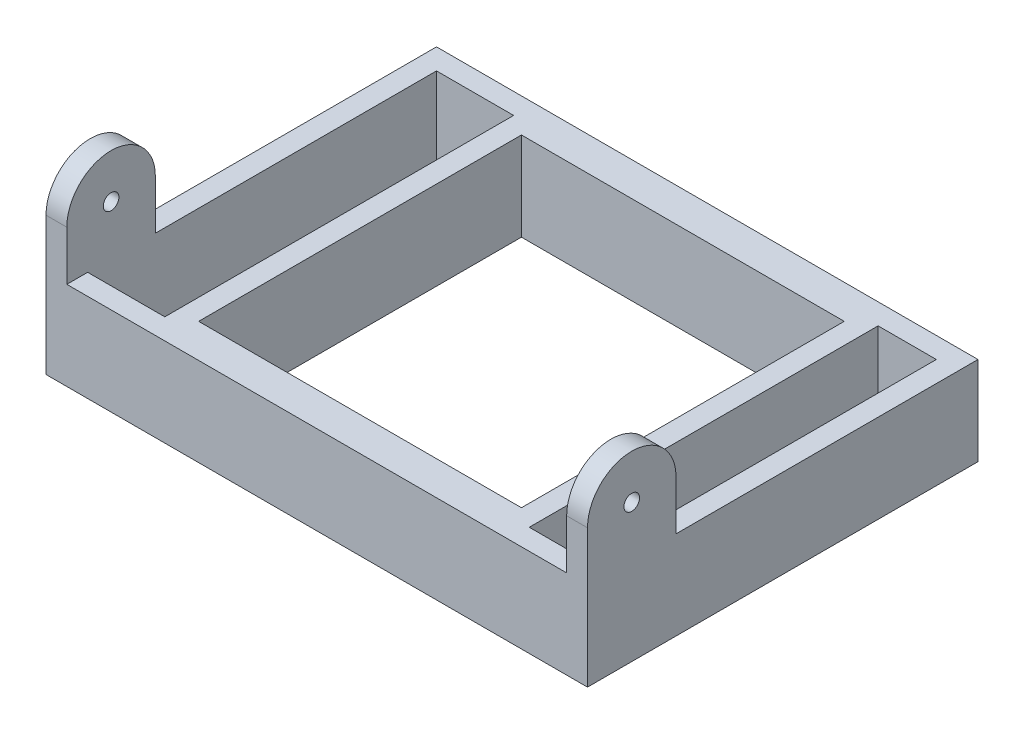
ISO-10303-21;
HEADER;
FILE_DESCRIPTION(('STEP AP214'),'2;1');
FILE_NAME('part.step','',(''),(''),'','','');
FILE_SCHEMA(('AUTOMOTIVE_DESIGN { 1 0 10303 214 1 1 1 1 }'));
ENDSEC;
DATA;
#1=APPLICATION_CONTEXT('core data for automotive mechanical design processes');
#2=APPLICATION_PROTOCOL_DEFINITION('international standard','automotive_design',2000,#1);
#3=PRODUCT_CONTEXT('',#1,'mechanical');
#4=PRODUCT('Part','Part','',(#3));
#5=PRODUCT_RELATED_PRODUCT_CATEGORY('part','',(#4));
#6=PRODUCT_DEFINITION_FORMATION('','',#4);
#7=PRODUCT_DEFINITION_CONTEXT('part definition',#1,'design');
#8=PRODUCT_DEFINITION('design','',#6,#7);
#9=PRODUCT_DEFINITION_SHAPE('','',#8);
#10=(LENGTH_UNIT() NAMED_UNIT(*) SI_UNIT(.MILLI.,.METRE.));
#11=(NAMED_UNIT(*) PLANE_ANGLE_UNIT() SI_UNIT($,.RADIAN.));
#12=(NAMED_UNIT(*) SI_UNIT($,.STERADIAN.) SOLID_ANGLE_UNIT());
#13=UNCERTAINTY_MEASURE_WITH_UNIT(LENGTH_MEASURE(1.E-05),#10,'distance_accuracy_value','');
#14=(GEOMETRIC_REPRESENTATION_CONTEXT(3) GLOBAL_UNCERTAINTY_ASSIGNED_CONTEXT((#13)) GLOBAL_UNIT_ASSIGNED_CONTEXT((#10,
#11,#12)) REPRESENTATION_CONTEXT('',''));
#15=CARTESIAN_POINT('',(0.,0.,0.));
#16=DIRECTION('',(0.,0.,1.));
#17=DIRECTION('',(1.,0.,0.));
#18=AXIS2_PLACEMENT_3D('',#15,#16,#17);
#19=CARTESIAN_POINT('',(-24.9824031216202,17.,-67.0993378787123));
#20=DIRECTION('',(1.,0.,0.));
#21=DIRECTION('',(0.,0.,-1.));
#22=AXIS2_PLACEMENT_3D('',#19,#20,#21);
#23=PLANE('',#22);
#24=DIRECTION('',(0.,-1.,0.));
#25=VECTOR('',#24,1.);
#26=CARTESIAN_POINT('',(-24.9824031216202,17.,7.90066212128765));
#27=LINE('',#26,#25);
#28=CARTESIAN_POINT('',(-24.9824031216202,26.5,7.90066212128765));
#29=VERTEX_POINT('',#28);
#30=CARTESIAN_POINT('',(-24.9824031216202,0.,7.90066212128765));
#31=VERTEX_POINT('',#30);
#32=EDGE_CURVE('E73',#29,#31,#27,.T.);
#33=ORIENTED_EDGE('',*,*,#32,.F.);
#34=CARTESIAN_POINT('',(-24.9824031216202,26.5,-0.599337878712353));
#35=DIRECTION('',(-1.,0.,0.));
#36=DIRECTION('',(0.,0.,1.));
#37=AXIS2_PLACEMENT_3D('',#34,#35,#36);
#38=CIRCLE('',#37,8.5);
#39=CARTESIAN_POINT('',(-24.9824031216202,26.5,-9.09933787871235));
#40=VERTEX_POINT('',#39);
#41=EDGE_CURVE('E216',#40,#29,#38,.F.);
#42=ORIENTED_EDGE('',*,*,#41,.F.);
#43=DIRECTION('',(0.,-1.,0.));
#44=VECTOR('',#43,1.);
#45=CARTESIAN_POINT('',(-24.9824031216202,35.,-9.09933787871235));
#46=LINE('',#45,#44);
#47=CARTESIAN_POINT('',(-24.9824031216202,17.,-9.09933787871235));
#48=VERTEX_POINT('',#47);
#49=EDGE_CURVE('E412',#40,#48,#46,.T.);
#50=ORIENTED_EDGE('',*,*,#49,.T.);
#51=DIRECTION('',(0.,0.,1.));
#52=VECTOR('',#51,1.);
#53=CARTESIAN_POINT('',(-24.9824031216202,17.,-67.0993378787123));
#54=LINE('',#53,#52);
#55=CARTESIAN_POINT('',(-24.9824031216202,17.,-67.0993378787123));
#56=VERTEX_POINT('',#55);
#57=EDGE_CURVE('E273',#56,#48,#54,.T.);
#58=ORIENTED_EDGE('',*,*,#57,.F.);
#59=DIRECTION('',(0.,-1.,0.));
#60=VECTOR('',#59,1.);
#61=CARTESIAN_POINT('',(-24.9824031216202,17.,-67.0993378787123));
#62=LINE('',#61,#60);
#63=CARTESIAN_POINT('',(-24.9824031216202,0.,-67.0993378787123));
#64=VERTEX_POINT('',#63);
#65=EDGE_CURVE('E12',#56,#64,#62,.T.);
#66=ORIENTED_EDGE('',*,*,#65,.T.);
#67=DIRECTION('',(0.,0.,1.));
#68=VECTOR('',#67,1.);
#69=CARTESIAN_POINT('',(-24.9824031216202,0.,-67.0993378787123));
#70=LINE('',#69,#68);
#71=EDGE_CURVE('E240',#64,#31,#70,.T.);
#72=ORIENTED_EDGE('',*,*,#71,.T.);
#73=EDGE_LOOP('',(#33,#42,#50,#58,#66,#72));
#74=FACE_BOUND('',#73,.T.);
#75=CARTESIAN_POINT('',(-24.9824031216202,26.5,-0.599337878712353));
#76=DIRECTION('',(-1.,0.,0.));
#77=DIRECTION('',(0.,0.,1.));
#78=AXIS2_PLACEMENT_3D('',#75,#76,#77);
#79=CIRCLE('',#78,1.5);
#80=CARTESIAN_POINT('',(-24.9824031216202,26.5,0.900662121287647));
#81=VERTEX_POINT('',#80);
#82=EDGE_CURVE('E237',#81,#81,#79,.T.);
#83=ORIENTED_EDGE('',*,*,#82,.F.);
#84=EDGE_LOOP('',(#83));
#85=FACE_BOUND('',#84,.T.);
#86=ADVANCED_FACE('F63',(#74,#85),#23,.F.);
#87=CARTESIAN_POINT('',(79.0175968783798,17.,7.90066212128765));
#88=DIRECTION('',(-1.,0.,0.));
#89=DIRECTION('',(0.,0.,1.));
#90=AXIS2_PLACEMENT_3D('',#87,#88,#89);
#91=PLANE('',#90);
#92=CARTESIAN_POINT('',(79.0175968783798,26.5,-0.599337878712353));
#93=DIRECTION('',(-1.,0.,0.));
#94=DIRECTION('',(0.,0.,1.));
#95=AXIS2_PLACEMENT_3D('',#92,#93,#94);
#96=CIRCLE('',#95,8.5);
#97=CARTESIAN_POINT('',(79.0175968783798,26.5,-9.09933787871235));
#98=VERTEX_POINT('',#97);
#99=CARTESIAN_POINT('',(79.0175968783798,26.5,7.90066212128765));
#100=VERTEX_POINT('',#99);
#101=EDGE_CURVE('E437',#98,#100,#96,.F.);
#102=ORIENTED_EDGE('',*,*,#101,.T.);
#103=DIRECTION('',(0.,-1.,0.));
#104=VECTOR('',#103,1.);
#105=CARTESIAN_POINT('',(79.0175968783798,17.,7.90066212128765));
#106=LINE('',#105,#104);
#107=CARTESIAN_POINT('',(79.0175968783798,0.,7.90066212128765));
#108=VERTEX_POINT('',#107);
#109=EDGE_CURVE('E243',#100,#108,#106,.T.);
#110=ORIENTED_EDGE('',*,*,#109,.T.);
#111=DIRECTION('',(0.,0.,-1.));
#112=VECTOR('',#111,1.);
#113=CARTESIAN_POINT('',(79.0175968783798,0.,7.90066212128765));
#114=LINE('',#113,#112);
#115=CARTESIAN_POINT('',(79.0175968783798,0.,-67.0993378787123));
#116=VERTEX_POINT('',#115);
#117=EDGE_CURVE('E253',#108,#116,#114,.T.);
#118=ORIENTED_EDGE('',*,*,#117,.T.);
#119=DIRECTION('',(0.,-1.,0.));
#120=VECTOR('',#119,1.);
#121=CARTESIAN_POINT('',(79.0175968783798,17.,-67.0993378787123));
#122=LINE('',#121,#120);
#123=CARTESIAN_POINT('',(79.0175968783798,17.,-67.0993378787123));
#124=VERTEX_POINT('',#123);
#125=EDGE_CURVE('E246',#124,#116,#122,.T.);
#126=ORIENTED_EDGE('',*,*,#125,.F.);
#127=DIRECTION('',(0.,0.,-1.));
#128=VECTOR('',#127,1.);
#129=CARTESIAN_POINT('',(79.0175968783798,17.,7.90066212128765));
#130=LINE('',#129,#128);
#131=CARTESIAN_POINT('',(79.0175968783798,17.,-9.09933787871235));
#132=VERTEX_POINT('',#131);
#133=EDGE_CURVE('E252',#132,#124,#130,.T.);
#134=ORIENTED_EDGE('',*,*,#133,.F.);
#135=DIRECTION('',(0.,-1.,0.));
#136=VECTOR('',#135,1.);
#137=CARTESIAN_POINT('',(79.0175968783798,35.,-9.09933787871235));
#138=LINE('',#137,#136);
#139=EDGE_CURVE('E422',#98,#132,#138,.T.);
#140=ORIENTED_EDGE('',*,*,#139,.F.);
#141=EDGE_LOOP('',(#102,#110,#118,#126,#134,#140));
#142=FACE_BOUND('',#141,.T.);
#143=CARTESIAN_POINT('',(79.0175968783798,26.5,-0.599337878712353));
#144=DIRECTION('',(-1.,0.,0.));
#145=DIRECTION('',(0.,0.,1.));
#146=AXIS2_PLACEMENT_3D('',#143,#144,#145);
#147=CIRCLE('',#146,1.5);
#148=CARTESIAN_POINT('',(79.0175968783798,26.5,0.900662121287647));
#149=VERTEX_POINT('',#148);
#150=EDGE_CURVE('E227',#149,#149,#147,.T.);
#151=ORIENTED_EDGE('',*,*,#150,.T.);
#152=EDGE_LOOP('',(#151));
#153=FACE_BOUND('',#152,.T.);
#154=ADVANCED_FACE('F462',(#142,#153),#91,.F.);
#155=CARTESIAN_POINT('',(-20.9824031216202,17.,-63.0993378787123));
#156=DIRECTION('',(1.,0.,0.));
#157=DIRECTION('',(0.,0.,-1.));
#158=AXIS2_PLACEMENT_3D('',#155,#156,#157);
#159=PLANE('',#158);
#160=CARTESIAN_POINT('',(-20.9824031216202,26.5,-0.599337878712353));
#161=DIRECTION('',(1.,0.,0.));
#162=DIRECTION('',(0.,0.,-1.));
#163=AXIS2_PLACEMENT_3D('',#160,#161,#162);
#164=CIRCLE('',#163,8.5);
#165=CARTESIAN_POINT('',(-20.9824031216202,26.5,7.90066212128765));
#166=VERTEX_POINT('',#165);
#167=CARTESIAN_POINT('',(-20.9824031216202,26.5,-9.09933787871235));
#168=VERTEX_POINT('',#167);
#169=EDGE_CURVE('E440',#166,#168,#164,.F.);
#170=ORIENTED_EDGE('',*,*,#169,.F.);
#171=DIRECTION('',(0.,-1.,0.));
#172=VECTOR('',#171,1.);
#173=CARTESIAN_POINT('',(-20.9824031216202,35.,7.90066212128765));
#174=LINE('',#173,#172);
#175=CARTESIAN_POINT('',(-20.9824031216202,17.,7.90066212128765));
#176=VERTEX_POINT('',#175);
#177=EDGE_CURVE('E234',#166,#176,#174,.T.);
#178=ORIENTED_EDGE('',*,*,#177,.T.);
#179=DIRECTION('',(0.,0.,-1.));
#180=VECTOR('',#179,1.);
#181=CARTESIAN_POINT('',(-20.9824031216202,17.,7.90066212128765));
#182=LINE('',#181,#180);
#183=CARTESIAN_POINT('',(-20.9824031216202,17.,3.90066212128765));
#184=VERTEX_POINT('',#183);
#185=EDGE_CURVE('E419',#176,#184,#182,.T.);
#186=ORIENTED_EDGE('',*,*,#185,.T.);
#187=DIRECTION('',(0.,-1.,0.));
#188=VECTOR('',#187,1.);
#189=CARTESIAN_POINT('',(-20.9824031216202,17.,3.90066212128765));
#190=LINE('',#189,#188);
#191=CARTESIAN_POINT('',(-20.9824031216202,0.,3.90066212128765));
#192=VERTEX_POINT('',#191);
#193=EDGE_CURVE('E311',#184,#192,#190,.T.);
#194=ORIENTED_EDGE('',*,*,#193,.T.);
#195=DIRECTION('',(0.,0.,1.));
#196=VECTOR('',#195,1.);
#197=CARTESIAN_POINT('',(-20.9824031216202,0.,-63.0993378787123));
#198=LINE('',#197,#196);
#199=CARTESIAN_POINT('',(-20.9824031216202,0.,-63.0993378787123));
#200=VERTEX_POINT('',#199);
#201=EDGE_CURVE('E350',#200,#192,#198,.T.);
#202=ORIENTED_EDGE('',*,*,#201,.F.);
#203=DIRECTION('',(0.,-1.,0.));
#204=VECTOR('',#203,1.);
#205=CARTESIAN_POINT('',(-20.9824031216202,17.,-63.0993378787123));
#206=LINE('',#205,#204);
#207=CARTESIAN_POINT('',(-20.9824031216202,17.,-63.0993378787123));
#208=VERTEX_POINT('',#207);
#209=EDGE_CURVE('E332',#208,#200,#206,.T.);
#210=ORIENTED_EDGE('',*,*,#209,.F.);
#211=DIRECTION('',(0.,0.,1.));
#212=VECTOR('',#211,1.);
#213=CARTESIAN_POINT('',(-20.9824031216202,17.,-63.0993378787123));
#214=LINE('',#213,#212);
#215=CARTESIAN_POINT('',(-20.9824031216202,17.,-9.09933787871235));
#216=VERTEX_POINT('',#215);
#217=EDGE_CURVE('E341',#208,#216,#214,.T.);
#218=ORIENTED_EDGE('',*,*,#217,.T.);
#219=DIRECTION('',(0.,-1.,0.));
#220=VECTOR('',#219,1.);
#221=CARTESIAN_POINT('',(-20.9824031216202,35.,-9.09933787871235));
#222=LINE('',#221,#220);
#223=EDGE_CURVE('E409',#168,#216,#222,.T.);
#224=ORIENTED_EDGE('',*,*,#223,.F.);
#225=EDGE_LOOP('',(#170,#178,#186,#194,#202,#210,#218,#224));
#226=FACE_BOUND('',#225,.T.);
#227=CARTESIAN_POINT('',(-20.9824031216202,26.5,-0.599337878712353));
#228=DIRECTION('',(1.,0.,0.));
#229=DIRECTION('',(0.,0.,-1.));
#230=AXIS2_PLACEMENT_3D('',#227,#228,#229);
#231=CIRCLE('',#230,1.5);
#232=CARTESIAN_POINT('',(-20.9824031216202,26.5,-2.09933787871235));
#233=VERTEX_POINT('',#232);
#234=EDGE_CURVE('E452',#233,#233,#231,.T.);
#235=ORIENTED_EDGE('',*,*,#234,.F.);
#236=EDGE_LOOP('',(#235));
#237=FACE_BOUND('',#236,.T.);
#238=ADVANCED_FACE('F466',(#226,#237),#159,.T.);
#239=CARTESIAN_POINT('',(75.0175968783798,17.,-63.0993378787123));
#240=DIRECTION('',(-1.,0.,0.));
#241=DIRECTION('',(0.,0.,1.));
#242=AXIS2_PLACEMENT_3D('',#239,#240,#241);
#243=PLANE('',#242);
#244=DIRECTION('',(0.,-1.,0.));
#245=VECTOR('',#244,1.);
#246=CARTESIAN_POINT('',(75.0175968783798,35.,7.90066212128765));
#247=LINE('',#246,#245);
#248=CARTESIAN_POINT('',(75.0175968783798,26.5,7.90066212128765));
#249=VERTEX_POINT('',#248);
#250=CARTESIAN_POINT('',(75.0175968783798,17.,7.90066212128765));
#251=VERTEX_POINT('',#250);
#252=EDGE_CURVE('E427',#249,#251,#247,.T.);
#253=ORIENTED_EDGE('',*,*,#252,.F.);
#254=CARTESIAN_POINT('',(75.0175968783798,26.5,-0.599337878712353));
#255=DIRECTION('',(-1.,0.,0.));
#256=DIRECTION('',(0.,0.,1.));
#257=AXIS2_PLACEMENT_3D('',#254,#255,#256);
#258=CIRCLE('',#257,8.5);
#259=CARTESIAN_POINT('',(75.0175968783798,26.5,-9.09933787871235));
#260=VERTEX_POINT('',#259);
#261=EDGE_CURVE('E443',#260,#249,#258,.F.);
#262=ORIENTED_EDGE('',*,*,#261,.F.);
#263=DIRECTION('',(0.,-1.,0.));
#264=VECTOR('',#263,1.);
#265=CARTESIAN_POINT('',(75.0175968783798,35.,-9.09933787871235));
#266=LINE('',#265,#264);
#267=CARTESIAN_POINT('',(75.0175968783798,17.,-9.09933787871235));
#268=VERTEX_POINT('',#267);
#269=EDGE_CURVE('E80',#260,#268,#266,.T.);
#270=ORIENTED_EDGE('',*,*,#269,.T.);
#271=DIRECTION('',(0.,0.,-1.));
#272=VECTOR('',#271,1.);
#273=CARTESIAN_POINT('',(75.0175968783798,17.,-63.0993378787123));
#274=LINE('',#273,#272);
#275=CARTESIAN_POINT('',(75.0175968783798,17.,-63.0993378787123));
#276=VERTEX_POINT('',#275);
#277=EDGE_CURVE('E384',#268,#276,#274,.T.);
#278=ORIENTED_EDGE('',*,*,#277,.T.);
#279=DIRECTION('',(0.,-1.,0.));
#280=VECTOR('',#279,1.);
#281=CARTESIAN_POINT('',(75.0175968783798,17.,-63.0993378787123));
#282=LINE('',#281,#280);
#283=CARTESIAN_POINT('',(75.0175968783798,0.,-63.0993378787123));
#284=VERTEX_POINT('',#283);
#285=EDGE_CURVE('E354',#276,#284,#282,.T.);
#286=ORIENTED_EDGE('',*,*,#285,.T.);
#287=DIRECTION('',(0.,0.,-1.));
#288=VECTOR('',#287,1.);
#289=CARTESIAN_POINT('',(75.0175968783798,0.,-63.0993378787123));
#290=LINE('',#289,#288);
#291=CARTESIAN_POINT('',(75.0175968783798,0.,3.90066212128765));
#292=VERTEX_POINT('',#291);
#293=EDGE_CURVE('E393',#292,#284,#290,.T.);
#294=ORIENTED_EDGE('',*,*,#293,.F.);
#295=DIRECTION('',(0.,-1.,0.));
#296=VECTOR('',#295,1.);
#297=CARTESIAN_POINT('',(75.0175968783798,17.,3.90066212128765));
#298=LINE('',#297,#296);
#299=CARTESIAN_POINT('',(75.0175968783798,17.,3.90066212128765));
#300=VERTEX_POINT('',#299);
#301=EDGE_CURVE('E375',#300,#292,#298,.T.);
#302=ORIENTED_EDGE('',*,*,#301,.F.);
#303=DIRECTION('',(0.,0.,1.));
#304=VECTOR('',#303,1.);
#305=CARTESIAN_POINT('',(75.0175968783798,17.,7.90066212128765));
#306=LINE('',#305,#304);
#307=EDGE_CURVE('E430',#300,#251,#306,.T.);
#308=ORIENTED_EDGE('',*,*,#307,.T.);
#309=EDGE_LOOP('',(#253,#262,#270,#278,#286,#294,#302,#308));
#310=FACE_BOUND('',#309,.T.);
#311=CARTESIAN_POINT('',(75.0175968783798,26.5,-0.599337878712353));
#312=DIRECTION('',(-1.,0.,0.));
#313=DIRECTION('',(0.,0.,1.));
#314=AXIS2_PLACEMENT_3D('',#311,#312,#313);
#315=CIRCLE('',#314,1.5);
#316=CARTESIAN_POINT('',(75.0175968783798,26.5,0.900662121287647));
#317=VERTEX_POINT('',#316);
#318=EDGE_CURVE('E67',#317,#317,#315,.T.);
#319=ORIENTED_EDGE('',*,*,#318,.F.);
#320=EDGE_LOOP('',(#319));
#321=FACE_BOUND('',#320,.T.);
#322=ADVANCED_FACE('F472',(#310,#321),#243,.T.);
#323=CARTESIAN_POINT('',(-24.9824031216202,17.,7.90066212128765));
#324=DIRECTION('',(0.,0.,-1.));
#325=DIRECTION('',(-1.,0.,0.));
#326=AXIS2_PLACEMENT_3D('',#323,#324,#325);
#327=PLANE('',#326);
#328=DIRECTION('',(-1.,0.,0.));
#329=VECTOR('',#328,1.);
#330=CARTESIAN_POINT('',(125.01759687838,26.5,7.90066212128765));
#331=LINE('',#330,#329);
#332=EDGE_CURVE('E219',#166,#29,#331,.T.);
#333=ORIENTED_EDGE('',*,*,#332,.T.);
#334=ORIENTED_EDGE('',*,*,#32,.T.);
#335=DIRECTION('',(1.,0.,0.));
#336=VECTOR('',#335,1.);
#337=CARTESIAN_POINT('',(-24.9824031216202,0.,7.90066212128765));
#338=LINE('',#337,#336);
#339=EDGE_CURVE('E257',#31,#108,#338,.T.);
#340=ORIENTED_EDGE('',*,*,#339,.T.);
#341=ORIENTED_EDGE('',*,*,#109,.F.);
#342=EDGE_CURVE('E236',#100,#249,#331,.T.);
#343=ORIENTED_EDGE('',*,*,#342,.T.);
#344=ORIENTED_EDGE('',*,*,#252,.T.);
#345=DIRECTION('',(1.,0.,0.));
#346=VECTOR('',#345,1.);
#347=CARTESIAN_POINT('',(-24.9824031216202,17.,7.90066212128765));
#348=LINE('',#347,#346);
#349=EDGE_CURVE('E269',#176,#251,#348,.T.);
#350=ORIENTED_EDGE('',*,*,#349,.F.);
#351=ORIENTED_EDGE('',*,*,#177,.F.);
#352=EDGE_LOOP('',(#333,#334,#340,#341,#343,#344,#350,#351));
#353=FACE_BOUND('',#352,.T.);
#354=ADVANCED_FACE('F230',(#353),#327,.F.);
#355=CARTESIAN_POINT('',(0.,17.,0.));
#356=DIRECTION('',(0.,1.,0.));
#357=DIRECTION('',(0.,0.,1.));
#358=AXIS2_PLACEMENT_3D('',#355,#356,#357);
#359=PLANE('',#358);
#360=DIRECTION('',(0.,0.,1.));
#361=VECTOR('',#360,1.);
#362=CARTESIAN_POINT('',(-2.16849029039037,17.,-60.5993378787123));
#363=LINE('',#362,#361);
#364=CARTESIAN_POINT('',(-2.16849029039037,17.,-60.5993378787123));
#365=VERTEX_POINT('',#364);
#366=CARTESIAN_POINT('',(-2.16849029039037,17.,1.40066212128769));
#367=VERTEX_POINT('',#366);
#368=EDGE_CURVE('E318',#365,#367,#363,.T.);
#369=ORIENTED_EDGE('',*,*,#368,.F.);
#370=DIRECTION('',(-1.,0.,0.));
#371=VECTOR('',#370,1.);
#372=CARTESIAN_POINT('',(-2.16849029039037,17.,-60.5993378787123));
#373=LINE('',#372,#371);
#374=CARTESIAN_POINT('',(59.8315097096096,17.,-60.5993378787123));
#375=VERTEX_POINT('',#374);
#376=EDGE_CURVE('E298',#375,#365,#373,.T.);
#377=ORIENTED_EDGE('',*,*,#376,.F.);
#378=DIRECTION('',(0.,0.,-1.));
#379=VECTOR('',#378,1.);
#380=CARTESIAN_POINT('',(59.8315097096096,17.,-60.5993378787123));
#381=LINE('',#380,#379);
#382=CARTESIAN_POINT('',(59.8315097096096,17.,1.40066212128769));
#383=VERTEX_POINT('',#382);
#384=EDGE_CURVE('E293',#383,#375,#381,.T.);
#385=ORIENTED_EDGE('',*,*,#384,.F.);
#386=DIRECTION('',(1.,0.,0.));
#387=VECTOR('',#386,1.);
#388=CARTESIAN_POINT('',(-2.16849029039037,17.,1.40066212128769));
#389=LINE('',#388,#387);
#390=EDGE_CURVE('E314',#367,#383,#389,.T.);
#391=ORIENTED_EDGE('',*,*,#390,.F.);
#392=EDGE_LOOP('',(#369,#377,#385,#391));
#393=FACE_BOUND('',#392,.T.);
#394=ORIENTED_EDGE('',*,*,#277,.F.);
#395=DIRECTION('',(-1.,0.,0.));
#396=VECTOR('',#395,1.);
#397=CARTESIAN_POINT('',(79.0175968783798,17.,-9.09933787871235));
#398=LINE('',#397,#396);
#399=EDGE_CURVE('E434',#132,#268,#398,.T.);
#400=ORIENTED_EDGE('',*,*,#399,.F.);
#401=ORIENTED_EDGE('',*,*,#133,.T.);
#402=DIRECTION('',(-1.,0.,0.));
#403=VECTOR('',#402,1.);
#404=CARTESIAN_POINT('',(79.0175968783798,17.,-67.0993378787123));
#405=LINE('',#404,#403);
#406=EDGE_CURVE('E256',#124,#56,#405,.T.);
#407=ORIENTED_EDGE('',*,*,#406,.T.);
#408=ORIENTED_EDGE('',*,*,#57,.T.);
#409=DIRECTION('',(-1.,0.,0.));
#410=VECTOR('',#409,1.);
#411=CARTESIAN_POINT('',(-24.9824031216202,17.,-9.09933787871235));
#412=LINE('',#411,#410);
#413=EDGE_CURVE('E415',#216,#48,#412,.T.);
#414=ORIENTED_EDGE('',*,*,#413,.F.);
#415=ORIENTED_EDGE('',*,*,#217,.F.);
#416=DIRECTION('',(-1.,0.,0.));
#417=VECTOR('',#416,1.);
#418=CARTESIAN_POINT('',(-20.9824031216202,17.,-63.0993378787123));
#419=LINE('',#418,#417);
#420=CARTESIAN_POINT('',(-6.16849029039037,17.,-63.0993378787123));
#421=VERTEX_POINT('',#420);
#422=EDGE_CURVE('E336',#421,#208,#419,.T.);
#423=ORIENTED_EDGE('',*,*,#422,.F.);
#424=DIRECTION('',(0.,0.,-1.));
#425=VECTOR('',#424,1.);
#426=CARTESIAN_POINT('',(-6.16849029039037,17.,-63.0993378787123));
#427=LINE('',#426,#425);
#428=CARTESIAN_POINT('',(-6.16849029039036,17.,3.90066212128766));
#429=VERTEX_POINT('',#428);
#430=EDGE_CURVE('E357',#429,#421,#427,.T.);
#431=ORIENTED_EDGE('',*,*,#430,.F.);
#432=DIRECTION('',(1.,0.,0.));
#433=VECTOR('',#432,1.);
#434=CARTESIAN_POINT('',(-20.9824031216202,17.,3.90066212128765));
#435=LINE('',#434,#433);
#436=EDGE_CURVE('E361',#184,#429,#435,.T.);
#437=ORIENTED_EDGE('',*,*,#436,.F.);
#438=ORIENTED_EDGE('',*,*,#185,.F.);
#439=ORIENTED_EDGE('',*,*,#349,.T.);
#440=ORIENTED_EDGE('',*,*,#307,.F.);
#441=DIRECTION('',(1.,0.,0.));
#442=VECTOR('',#441,1.);
#443=CARTESIAN_POINT('',(75.0175968783798,17.,3.90066212128765));
#444=LINE('',#443,#442);
#445=CARTESIAN_POINT('',(63.8315097096096,17.,3.90066212128765));
#446=VERTEX_POINT('',#445);
#447=EDGE_CURVE('E379',#446,#300,#444,.T.);
#448=ORIENTED_EDGE('',*,*,#447,.F.);
#449=DIRECTION('',(0.,0.,1.));
#450=VECTOR('',#449,1.);
#451=CARTESIAN_POINT('',(63.8315097096096,17.,-63.0993378787123));
#452=LINE('',#451,#450);
#453=CARTESIAN_POINT('',(63.8315097096096,17.,-63.0993378787123));
#454=VERTEX_POINT('',#453);
#455=EDGE_CURVE('E399',#454,#446,#452,.T.);
#456=ORIENTED_EDGE('',*,*,#455,.F.);
#457=DIRECTION('',(-1.,0.,0.));
#458=VECTOR('',#457,1.);
#459=CARTESIAN_POINT('',(63.8315097096096,17.,-63.0993378787123));
#460=LINE('',#459,#458);
#461=EDGE_CURVE('E402',#276,#454,#460,.T.);
#462=ORIENTED_EDGE('',*,*,#461,.F.);
#463=EDGE_LOOP('',(#394,#400,#401,#407,#408,#414,#415,#423,#431,#437,#438,#439,#440,#448,#456,#462));
#464=FACE_BOUND('',#463,.T.);
#465=ADVANCED_FACE('F471',(#393,#464),#359,.T.);
#466=CARTESIAN_POINT('',(0.,0.,0.));
#467=DIRECTION('',(0.,1.,0.));
#468=DIRECTION('',(0.,0.,1.));
#469=AXIS2_PLACEMENT_3D('',#466,#467,#468);
#470=PLANE('',#469);
#471=ORIENTED_EDGE('',*,*,#201,.T.);
#472=DIRECTION('',(1.,0.,0.));
#473=VECTOR('',#472,1.);
#474=CARTESIAN_POINT('',(-20.9824031216202,0.,3.90066212128765));
#475=LINE('',#474,#473);
#476=CARTESIAN_POINT('',(-6.16849029039036,0.,3.90066212128766));
#477=VERTEX_POINT('',#476);
#478=EDGE_CURVE('E346',#192,#477,#475,.T.);
#479=ORIENTED_EDGE('',*,*,#478,.T.);
#480=DIRECTION('',(0.,0.,-1.));
#481=VECTOR('',#480,1.);
#482=CARTESIAN_POINT('',(-6.16849029039037,0.,-63.0993378787123));
#483=LINE('',#482,#481);
#484=CARTESIAN_POINT('',(-6.16849029039037,0.,-63.0993378787123));
#485=VERTEX_POINT('',#484);
#486=EDGE_CURVE('E342',#477,#485,#483,.T.);
#487=ORIENTED_EDGE('',*,*,#486,.T.);
#488=DIRECTION('',(-1.,0.,0.));
#489=VECTOR('',#488,1.);
#490=CARTESIAN_POINT('',(-20.9824031216202,0.,-63.0993378787123));
#491=LINE('',#490,#489);
#492=EDGE_CURVE('E337',#485,#200,#491,.T.);
#493=ORIENTED_EDGE('',*,*,#492,.T.);
#494=EDGE_LOOP('',(#471,#479,#487,#493));
#495=FACE_BOUND('',#494,.T.);
#496=DIRECTION('',(-1.,0.,0.));
#497=VECTOR('',#496,1.);
#498=CARTESIAN_POINT('',(79.0175968783798,0.,-67.0993378787123));
#499=LINE('',#498,#497);
#500=EDGE_CURVE('E262',#116,#64,#499,.T.);
#501=ORIENTED_EDGE('',*,*,#500,.F.);
#502=ORIENTED_EDGE('',*,*,#117,.F.);
#503=ORIENTED_EDGE('',*,*,#339,.F.);
#504=ORIENTED_EDGE('',*,*,#71,.F.);
#505=EDGE_LOOP('',(#501,#502,#503,#504));
#506=FACE_BOUND('',#505,.T.);
#507=DIRECTION('',(-1.,0.,0.));
#508=VECTOR('',#507,1.);
#509=CARTESIAN_POINT('',(-2.16849029039037,0.,-60.5993378787123));
#510=LINE('',#509,#508);
#511=CARTESIAN_POINT('',(59.8315097096096,0.,-60.5993378787123));
#512=VERTEX_POINT('',#511);
#513=CARTESIAN_POINT('',(-2.16849029039037,0.,-60.5993378787123));
#514=VERTEX_POINT('',#513);
#515=EDGE_CURVE('E307',#512,#514,#510,.T.);
#516=ORIENTED_EDGE('',*,*,#515,.T.);
#517=DIRECTION('',(0.,0.,1.));
#518=VECTOR('',#517,1.);
#519=CARTESIAN_POINT('',(-2.16849029039037,0.,-60.5993378787123));
#520=LINE('',#519,#518);
#521=CARTESIAN_POINT('',(-2.16849029039037,0.,1.40066212128769));
#522=VERTEX_POINT('',#521);
#523=EDGE_CURVE('E303',#514,#522,#520,.T.);
#524=ORIENTED_EDGE('',*,*,#523,.T.);
#525=DIRECTION('',(1.,0.,0.));
#526=VECTOR('',#525,1.);
#527=CARTESIAN_POINT('',(-2.16849029039037,0.,1.40066212128769));
#528=LINE('',#527,#526);
#529=CARTESIAN_POINT('',(59.8315097096096,0.,1.40066212128769));
#530=VERTEX_POINT('',#529);
#531=EDGE_CURVE('E299',#522,#530,#528,.T.);
#532=ORIENTED_EDGE('',*,*,#531,.T.);
#533=DIRECTION('',(0.,0.,-1.));
#534=VECTOR('',#533,1.);
#535=CARTESIAN_POINT('',(59.8315097096096,0.,-60.5993378787123));
#536=LINE('',#535,#534);
#537=EDGE_CURVE('E294',#530,#512,#536,.T.);
#538=ORIENTED_EDGE('',*,*,#537,.T.);
#539=EDGE_LOOP('',(#516,#524,#532,#538));
#540=FACE_BOUND('',#539,.T.);
#541=ORIENTED_EDGE('',*,*,#293,.T.);
#542=DIRECTION('',(-1.,0.,0.));
#543=VECTOR('',#542,1.);
#544=CARTESIAN_POINT('',(63.8315097096096,0.,-63.0993378787123));
#545=LINE('',#544,#543);
#546=CARTESIAN_POINT('',(63.8315097096096,0.,-63.0993378787123));
#547=VERTEX_POINT('',#546);
#548=EDGE_CURVE('E389',#284,#547,#545,.T.);
#549=ORIENTED_EDGE('',*,*,#548,.T.);
#550=DIRECTION('',(0.,0.,1.));
#551=VECTOR('',#550,1.);
#552=CARTESIAN_POINT('',(63.8315097096096,0.,-63.0993378787123));
#553=LINE('',#552,#551);
#554=CARTESIAN_POINT('',(63.8315097096096,0.,3.90066212128765));
#555=VERTEX_POINT('',#554);
#556=EDGE_CURVE('E385',#547,#555,#553,.T.);
#557=ORIENTED_EDGE('',*,*,#556,.T.);
#558=DIRECTION('',(1.,0.,0.));
#559=VECTOR('',#558,1.);
#560=CARTESIAN_POINT('',(75.0175968783798,0.,3.90066212128765));
#561=LINE('',#560,#559);
#562=EDGE_CURVE('E380',#555,#292,#561,.T.);
#563=ORIENTED_EDGE('',*,*,#562,.T.);
#564=EDGE_LOOP('',(#541,#549,#557,#563));
#565=FACE_BOUND('',#564,.T.);
#566=ADVANCED_FACE('F474',(#495,#506,#540,#565),#470,.F.);
#567=CARTESIAN_POINT('',(79.0175968783798,17.,-67.0993378787123));
#568=DIRECTION('',(0.,0.,1.));
#569=DIRECTION('',(1.,0.,0.));
#570=AXIS2_PLACEMENT_3D('',#567,#568,#569);
#571=PLANE('',#570);
#572=ORIENTED_EDGE('',*,*,#500,.T.);
#573=ORIENTED_EDGE('',*,*,#65,.F.);
#574=ORIENTED_EDGE('',*,*,#406,.F.);
#575=ORIENTED_EDGE('',*,*,#125,.T.);
#576=EDGE_LOOP('',(#572,#573,#574,#575));
#577=FACE_BOUND('',#576,.T.);
#578=ADVANCED_FACE('F65',(#577),#571,.F.);
#579=CARTESIAN_POINT('',(-2.16849029039037,17.,-60.5993378787123));
#580=DIRECTION('',(0.,0.,1.));
#581=DIRECTION('',(1.,0.,0.));
#582=AXIS2_PLACEMENT_3D('',#579,#580,#581);
#583=PLANE('',#582);
#584=ORIENTED_EDGE('',*,*,#515,.F.);
#585=DIRECTION('',(0.,-1.,0.));
#586=VECTOR('',#585,1.);
#587=CARTESIAN_POINT('',(59.8315097096096,17.,-60.5993378787123));
#588=LINE('',#587,#586);
#589=EDGE_CURVE('E289',#375,#512,#588,.T.);
#590=ORIENTED_EDGE('',*,*,#589,.F.);
#591=ORIENTED_EDGE('',*,*,#376,.T.);
#592=DIRECTION('',(0.,-1.,0.));
#593=VECTOR('',#592,1.);
#594=CARTESIAN_POINT('',(-2.16849029039037,17.,-60.5993378787123));
#595=LINE('',#594,#593);
#596=EDGE_CURVE('E266',#365,#514,#595,.T.);
#597=ORIENTED_EDGE('',*,*,#596,.T.);
#598=EDGE_LOOP('',(#584,#590,#591,#597));
#599=FACE_BOUND('',#598,.T.);
#600=ADVANCED_FACE('F481',(#599),#583,.T.);
#601=CARTESIAN_POINT('',(-2.16849029039037,17.,-60.5993378787123));
#602=DIRECTION('',(1.,0.,0.));
#603=DIRECTION('',(0.,0.,-1.));
#604=AXIS2_PLACEMENT_3D('',#601,#602,#603);
#605=PLANE('',#604);
#606=ORIENTED_EDGE('',*,*,#523,.F.);
#607=ORIENTED_EDGE('',*,*,#596,.F.);
#608=ORIENTED_EDGE('',*,*,#368,.T.);
#609=DIRECTION('',(0.,-1.,0.));
#610=VECTOR('',#609,1.);
#611=CARTESIAN_POINT('',(-2.16849029039037,17.,1.40066212128769));
#612=LINE('',#611,#610);
#613=EDGE_CURVE('E283',#367,#522,#612,.T.);
#614=ORIENTED_EDGE('',*,*,#613,.T.);
#615=EDGE_LOOP('',(#606,#607,#608,#614));
#616=FACE_BOUND('',#615,.T.);
#617=ADVANCED_FACE('F484',(#616),#605,.T.);
#618=CARTESIAN_POINT('',(-2.16849029039037,17.,1.40066212128769));
#619=DIRECTION('',(0.,0.,-1.));
#620=DIRECTION('',(-1.,0.,0.));
#621=AXIS2_PLACEMENT_3D('',#618,#619,#620);
#622=PLANE('',#621);
#623=ORIENTED_EDGE('',*,*,#531,.F.);
#624=ORIENTED_EDGE('',*,*,#613,.F.);
#625=ORIENTED_EDGE('',*,*,#390,.T.);
#626=DIRECTION('',(0.,-1.,0.));
#627=VECTOR('',#626,1.);
#628=CARTESIAN_POINT('',(59.8315097096096,17.,1.40066212128769));
#629=LINE('',#628,#627);
#630=EDGE_CURVE('E286',#383,#530,#629,.T.);
#631=ORIENTED_EDGE('',*,*,#630,.T.);
#632=EDGE_LOOP('',(#623,#624,#625,#631));
#633=FACE_BOUND('',#632,.T.);
#634=ADVANCED_FACE('F488',(#633),#622,.T.);
#635=CARTESIAN_POINT('',(59.8315097096096,17.,-60.5993378787123));
#636=DIRECTION('',(-1.,0.,0.));
#637=DIRECTION('',(0.,0.,1.));
#638=AXIS2_PLACEMENT_3D('',#635,#636,#637);
#639=PLANE('',#638);
#640=ORIENTED_EDGE('',*,*,#537,.F.);
#641=ORIENTED_EDGE('',*,*,#630,.F.);
#642=ORIENTED_EDGE('',*,*,#384,.T.);
#643=ORIENTED_EDGE('',*,*,#589,.T.);
#644=EDGE_LOOP('',(#640,#641,#642,#643));
#645=FACE_BOUND('',#644,.T.);
#646=ADVANCED_FACE('F492',(#645),#639,.T.);
#647=CARTESIAN_POINT('',(-20.9824031216202,17.,3.90066212128765));
#648=DIRECTION('',(0.,0.,-1.));
#649=DIRECTION('',(-1.,0.,0.));
#650=AXIS2_PLACEMENT_3D('',#647,#648,#649);
#651=PLANE('',#650);
#652=ORIENTED_EDGE('',*,*,#478,.F.);
#653=ORIENTED_EDGE('',*,*,#193,.F.);
#654=ORIENTED_EDGE('',*,*,#436,.T.);
#655=DIRECTION('',(0.,-1.,0.));
#656=VECTOR('',#655,1.);
#657=CARTESIAN_POINT('',(-6.16849029039036,17.,3.90066212128766));
#658=LINE('',#657,#656);
#659=EDGE_CURVE('E326',#429,#477,#658,.T.);
#660=ORIENTED_EDGE('',*,*,#659,.T.);
#661=EDGE_LOOP('',(#652,#653,#654,#660));
#662=FACE_BOUND('',#661,.T.);
#663=ADVANCED_FACE('F496',(#662),#651,.T.);
#664=CARTESIAN_POINT('',(-6.16849029039037,17.,-63.0993378787123));
#665=DIRECTION('',(-1.,0.,0.));
#666=DIRECTION('',(0.,0.,1.));
#667=AXIS2_PLACEMENT_3D('',#664,#665,#666);
#668=PLANE('',#667);
#669=ORIENTED_EDGE('',*,*,#486,.F.);
#670=ORIENTED_EDGE('',*,*,#659,.F.);
#671=ORIENTED_EDGE('',*,*,#430,.T.);
#672=DIRECTION('',(0.,-1.,0.));
#673=VECTOR('',#672,1.);
#674=CARTESIAN_POINT('',(-6.16849029039037,17.,-63.0993378787123));
#675=LINE('',#674,#673);
#676=EDGE_CURVE('E329',#421,#485,#675,.T.);
#677=ORIENTED_EDGE('',*,*,#676,.T.);
#678=EDGE_LOOP('',(#669,#670,#671,#677));
#679=FACE_BOUND('',#678,.T.);
#680=ADVANCED_FACE('F503',(#679),#668,.T.);
#681=CARTESIAN_POINT('',(-20.9824031216202,17.,-63.0993378787123));
#682=DIRECTION('',(0.,0.,1.));
#683=DIRECTION('',(1.,0.,0.));
#684=AXIS2_PLACEMENT_3D('',#681,#682,#683);
#685=PLANE('',#684);
#686=ORIENTED_EDGE('',*,*,#492,.F.);
#687=ORIENTED_EDGE('',*,*,#676,.F.);
#688=ORIENTED_EDGE('',*,*,#422,.T.);
#689=ORIENTED_EDGE('',*,*,#209,.T.);
#690=EDGE_LOOP('',(#686,#687,#688,#689));
#691=FACE_BOUND('',#690,.T.);
#692=ADVANCED_FACE('F507',(#691),#685,.T.);
#693=CARTESIAN_POINT('',(63.8315097096096,17.,-63.0993378787123));
#694=DIRECTION('',(0.,0.,1.));
#695=DIRECTION('',(1.,0.,0.));
#696=AXIS2_PLACEMENT_3D('',#693,#694,#695);
#697=PLANE('',#696);
#698=ORIENTED_EDGE('',*,*,#548,.F.);
#699=ORIENTED_EDGE('',*,*,#285,.F.);
#700=ORIENTED_EDGE('',*,*,#461,.T.);
#701=DIRECTION('',(0.,-1.,0.));
#702=VECTOR('',#701,1.);
#703=CARTESIAN_POINT('',(63.8315097096096,17.,-63.0993378787123));
#704=LINE('',#703,#702);
#705=EDGE_CURVE('E370',#454,#547,#704,.T.);
#706=ORIENTED_EDGE('',*,*,#705,.T.);
#707=EDGE_LOOP('',(#698,#699,#700,#706));
#708=FACE_BOUND('',#707,.T.);
#709=ADVANCED_FACE('F511',(#708),#697,.T.);
#710=CARTESIAN_POINT('',(63.8315097096096,17.,-63.0993378787123));
#711=DIRECTION('',(1.,0.,0.));
#712=DIRECTION('',(0.,0.,-1.));
#713=AXIS2_PLACEMENT_3D('',#710,#711,#712);
#714=PLANE('',#713);
#715=ORIENTED_EDGE('',*,*,#556,.F.);
#716=ORIENTED_EDGE('',*,*,#705,.F.);
#717=ORIENTED_EDGE('',*,*,#455,.T.);
#718=DIRECTION('',(0.,-1.,0.));
#719=VECTOR('',#718,1.);
#720=CARTESIAN_POINT('',(63.8315097096096,17.,3.90066212128765));
#721=LINE('',#720,#719);
#722=EDGE_CURVE('E88',#446,#555,#721,.T.);
#723=ORIENTED_EDGE('',*,*,#722,.T.);
#724=EDGE_LOOP('',(#715,#716,#717,#723));
#725=FACE_BOUND('',#724,.T.);
#726=ADVANCED_FACE('F517',(#725),#714,.T.);
#727=CARTESIAN_POINT('',(75.0175968783798,17.,3.90066212128765));
#728=DIRECTION('',(0.,0.,-1.));
#729=DIRECTION('',(-1.,0.,0.));
#730=AXIS2_PLACEMENT_3D('',#727,#728,#729);
#731=PLANE('',#730);
#732=ORIENTED_EDGE('',*,*,#562,.F.);
#733=ORIENTED_EDGE('',*,*,#722,.F.);
#734=ORIENTED_EDGE('',*,*,#447,.T.);
#735=ORIENTED_EDGE('',*,*,#301,.T.);
#736=EDGE_LOOP('',(#732,#733,#734,#735));
#737=FACE_BOUND('',#736,.T.);
#738=ADVANCED_FACE('F521',(#737),#731,.T.);
#739=CARTESIAN_POINT('',(-24.9824031216202,35.,-9.09933787871235));
#740=DIRECTION('',(0.,0.,1.));
#741=DIRECTION('',(1.,0.,0.));
#742=AXIS2_PLACEMENT_3D('',#739,#740,#741);
#743=PLANE('',#742);
#744=ORIENTED_EDGE('',*,*,#49,.F.);
#745=DIRECTION('',(-1.,0.,0.));
#746=VECTOR('',#745,1.);
#747=CARTESIAN_POINT('',(125.01759687838,26.5,-9.09933787871235));
#748=LINE('',#747,#746);
#749=EDGE_CURVE('E222',#168,#40,#748,.T.);
#750=ORIENTED_EDGE('',*,*,#749,.F.);
#751=ORIENTED_EDGE('',*,*,#223,.T.);
#752=ORIENTED_EDGE('',*,*,#413,.T.);
#753=EDGE_LOOP('',(#744,#750,#751,#752));
#754=FACE_BOUND('',#753,.T.);
#755=ADVANCED_FACE('F525',(#754),#743,.F.);
#756=CARTESIAN_POINT('',(79.0175968783798,35.,-9.09933787871235));
#757=DIRECTION('',(0.,0.,1.));
#758=DIRECTION('',(1.,0.,0.));
#759=AXIS2_PLACEMENT_3D('',#756,#757,#758);
#760=PLANE('',#759);
#761=ORIENTED_EDGE('',*,*,#269,.F.);
#762=EDGE_CURVE('E446',#98,#260,#748,.T.);
#763=ORIENTED_EDGE('',*,*,#762,.F.);
#764=ORIENTED_EDGE('',*,*,#139,.T.);
#765=ORIENTED_EDGE('',*,*,#399,.T.);
#766=EDGE_LOOP('',(#761,#763,#764,#765));
#767=FACE_BOUND('',#766,.T.);
#768=ADVANCED_FACE('F528',(#767),#760,.F.);
#769=CARTESIAN_POINT('',(125.01759687838,26.5,-0.599337878712353));
#770=DIRECTION('',(-1.,0.,0.));
#771=DIRECTION('',(0.,0.,1.));
#772=AXIS2_PLACEMENT_3D('',#769,#770,#771);
#773=CYLINDRICAL_SURFACE('',#772,8.5);
#774=ORIENTED_EDGE('',*,*,#762,.T.);
#775=ORIENTED_EDGE('',*,*,#261,.T.);
#776=ORIENTED_EDGE('',*,*,#342,.F.);
#777=ORIENTED_EDGE('',*,*,#101,.F.);
#778=EDGE_LOOP('',(#774,#775,#776,#777));
#779=FACE_BOUND('',#778,.T.);
#780=ADVANCED_FACE('F532',(#779),#773,.T.);
#781=ORIENTED_EDGE('',*,*,#169,.T.);
#782=ORIENTED_EDGE('',*,*,#749,.T.);
#783=ORIENTED_EDGE('',*,*,#41,.T.);
#784=ORIENTED_EDGE('',*,*,#332,.F.);
#785=EDGE_LOOP('',(#781,#782,#783,#784));
#786=FACE_BOUND('',#785,.T.);
#787=ADVANCED_FACE('F218',(#786),#773,.T.);
#788=CARTESIAN_POINT('',(125.01759687838,26.5,-0.599337878712353));
#789=DIRECTION('',(-1.,0.,0.));
#790=DIRECTION('',(0.,0.,1.));
#791=AXIS2_PLACEMENT_3D('',#788,#789,#790);
#792=CYLINDRICAL_SURFACE('',#791,1.5);
#793=ORIENTED_EDGE('',*,*,#318,.T.);
#794=EDGE_LOOP('',(#793));
#795=FACE_BOUND('',#794,.T.);
#796=ORIENTED_EDGE('',*,*,#150,.F.);
#797=EDGE_LOOP('',(#796));
#798=FACE_BOUND('',#797,.T.);
#799=ADVANCED_FACE('F537',(#795,#798),#792,.F.);
#800=ORIENTED_EDGE('',*,*,#234,.T.);
#801=EDGE_LOOP('',(#800));
#802=FACE_BOUND('',#801,.T.);
#803=ORIENTED_EDGE('',*,*,#82,.T.);
#804=EDGE_LOOP('',(#803));
#805=FACE_BOUND('',#804,.T.);
#806=ADVANCED_FACE('F460',(#802,#805),#792,.F.);
#807=CLOSED_SHELL('',(#86,#154,#238,#322,#354,#465,#566,#578,#600,#617,#634,#646,#663,#680,#692,
#709,#726,#738,#755,#768,#780,#787,#799,#806));
#808=MANIFOLD_SOLID_BREP('B2',#807);
#809=ADVANCED_BREP_SHAPE_REPRESENTATION('',(#18,#808),#14);
#810=SHAPE_DEFINITION_REPRESENTATION(#9,#809);
ENDSEC;
END-ISO-10303-21;
